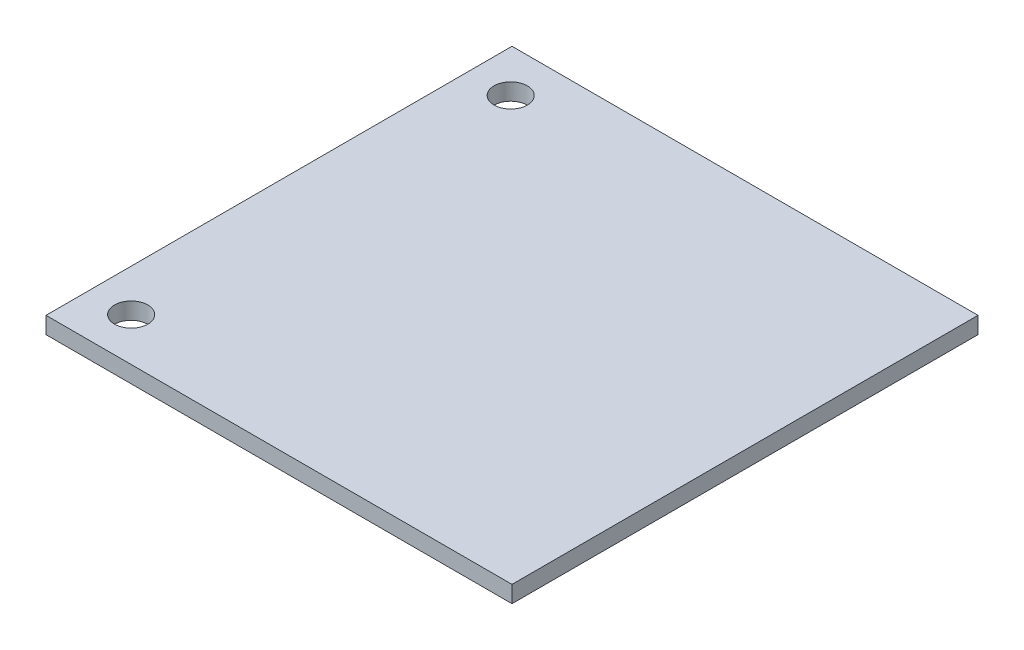
ISO-10303-21;
HEADER;
FILE_DESCRIPTION(('STEP AP214'),'2;1');
FILE_NAME('part.step','',(''),(''),'','','');
FILE_SCHEMA(('AUTOMOTIVE_DESIGN { 1 0 10303 214 1 1 1 1 }'));
ENDSEC;
DATA;
#1=APPLICATION_CONTEXT('core data for automotive mechanical design processes');
#2=APPLICATION_PROTOCOL_DEFINITION('international standard','automotive_design',2000,#1);
#3=PRODUCT_CONTEXT('',#1,'mechanical');
#4=PRODUCT('Part','Part','',(#3));
#5=PRODUCT_RELATED_PRODUCT_CATEGORY('part','',(#4));
#6=PRODUCT_DEFINITION_FORMATION('','',#4);
#7=PRODUCT_DEFINITION_CONTEXT('part definition',#1,'design');
#8=PRODUCT_DEFINITION('design','',#6,#7);
#9=PRODUCT_DEFINITION_SHAPE('','',#8);
#10=(LENGTH_UNIT() NAMED_UNIT(*) SI_UNIT(.MILLI.,.METRE.));
#11=(NAMED_UNIT(*) PLANE_ANGLE_UNIT() SI_UNIT($,.RADIAN.));
#12=(NAMED_UNIT(*) SI_UNIT($,.STERADIAN.) SOLID_ANGLE_UNIT());
#13=UNCERTAINTY_MEASURE_WITH_UNIT(LENGTH_MEASURE(1.E-05),#10,'distance_accuracy_value','');
#14=(GEOMETRIC_REPRESENTATION_CONTEXT(3) GLOBAL_UNCERTAINTY_ASSIGNED_CONTEXT((#13)) GLOBAL_UNIT_ASSIGNED_CONTEXT((#10,
#11,#12)) REPRESENTATION_CONTEXT('',''));
#15=CARTESIAN_POINT('',(0.,0.,0.));
#16=DIRECTION('',(0.,0.,1.));
#17=DIRECTION('',(1.,0.,0.));
#18=AXIS2_PLACEMENT_3D('',#15,#16,#17);
#19=CARTESIAN_POINT('',(0.,1.6,0.));
#20=DIRECTION('',(0.,1.,0.));
#21=DIRECTION('',(0.,0.,1.));
#22=AXIS2_PLACEMENT_3D('',#19,#20,#21);
#23=PLANE('',#22);
#24=CARTESIAN_POINT('',(-18.225,1.6,-18.1));
#25=DIRECTION('',(0.,1.,0.));
#26=DIRECTION('',(0.,0.,1.));
#27=AXIS2_PLACEMENT_3D('',#24,#25,#26);
#28=CIRCLE('',#27,1.59);
#29=CARTESIAN_POINT('',(-18.225,1.6,-16.51));
#30=VERTEX_POINT('',#29);
#31=EDGE_CURVE('E100',#30,#30,#28,.T.);
#32=ORIENTED_EDGE('',*,*,#31,.F.);
#33=EDGE_LOOP('',(#32));
#34=FACE_BOUND('',#33,.T.);
#35=DIRECTION('',(0.,0.,1.));
#36=VECTOR('',#35,1.);
#37=CARTESIAN_POINT('',(-22.225,1.6,-22.225));
#38=LINE('',#37,#36);
#39=CARTESIAN_POINT('',(-22.225,1.6,-22.225));
#40=VERTEX_POINT('',#39);
#41=CARTESIAN_POINT('',(-22.225,1.6,22.225));
#42=VERTEX_POINT('',#41);
#43=EDGE_CURVE('E85',#40,#42,#38,.T.);
#44=ORIENTED_EDGE('',*,*,#43,.T.);
#45=DIRECTION('',(1.,0.,0.));
#46=VECTOR('',#45,1.);
#47=CARTESIAN_POINT('',(-22.225,1.6,22.225));
#48=LINE('',#47,#46);
#49=CARTESIAN_POINT('',(22.225,1.6,22.225));
#50=VERTEX_POINT('',#49);
#51=EDGE_CURVE('E80',#42,#50,#48,.T.);
#52=ORIENTED_EDGE('',*,*,#51,.T.);
#53=DIRECTION('',(0.,0.,-1.));
#54=VECTOR('',#53,1.);
#55=CARTESIAN_POINT('',(22.225,1.6,-22.225));
#56=LINE('',#55,#54);
#57=CARTESIAN_POINT('',(22.225,1.6,-22.225));
#58=VERTEX_POINT('',#57);
#59=EDGE_CURVE('E83',#50,#58,#56,.T.);
#60=ORIENTED_EDGE('',*,*,#59,.T.);
#61=DIRECTION('',(-1.,0.,0.));
#62=VECTOR('',#61,1.);
#63=CARTESIAN_POINT('',(-22.225,1.6,-22.225));
#64=LINE('',#63,#62);
#65=EDGE_CURVE('E50',#58,#40,#64,.T.);
#66=ORIENTED_EDGE('',*,*,#65,.T.);
#67=EDGE_LOOP('',(#44,#52,#60,#66));
#68=FACE_BOUND('',#67,.T.);
#69=CARTESIAN_POINT('',(-18.225,1.6,18.1));
#70=DIRECTION('',(0.,1.,0.));
#71=DIRECTION('',(0.,0.,1.));
#72=AXIS2_PLACEMENT_3D('',#69,#70,#71);
#73=CIRCLE('',#72,1.59);
#74=CARTESIAN_POINT('',(-18.225,1.6,19.69));
#75=VERTEX_POINT('',#74);
#76=EDGE_CURVE('E115',#75,#75,#73,.T.);
#77=ORIENTED_EDGE('',*,*,#76,.F.);
#78=EDGE_LOOP('',(#77));
#79=FACE_BOUND('',#78,.T.);
#80=ADVANCED_FACE('F33',(#34,#68,#79),#23,.T.);
#81=CARTESIAN_POINT('',(0.,0.,0.));
#82=DIRECTION('',(0.,1.,0.));
#83=DIRECTION('',(0.,0.,1.));
#84=AXIS2_PLACEMENT_3D('',#81,#82,#83);
#85=PLANE('',#84);
#86=CARTESIAN_POINT('',(-18.225,0.,-18.1));
#87=DIRECTION('',(0.,1.,0.));
#88=DIRECTION('',(0.,0.,1.));
#89=AXIS2_PLACEMENT_3D('',#86,#87,#88);
#90=CIRCLE('',#89,1.59);
#91=CARTESIAN_POINT('',(-18.225,0.,-16.51));
#92=VERTEX_POINT('',#91);
#93=EDGE_CURVE('E112',#92,#92,#90,.T.);
#94=ORIENTED_EDGE('',*,*,#93,.T.);
#95=EDGE_LOOP('',(#94));
#96=FACE_BOUND('',#95,.T.);
#97=DIRECTION('',(0.,0.,1.));
#98=VECTOR('',#97,1.);
#99=CARTESIAN_POINT('',(-22.225,0.,-22.225));
#100=LINE('',#99,#98);
#101=CARTESIAN_POINT('',(-22.225,0.,-22.225));
#102=VERTEX_POINT('',#101);
#103=CARTESIAN_POINT('',(-22.225,0.,22.225));
#104=VERTEX_POINT('',#103);
#105=EDGE_CURVE('E97',#102,#104,#100,.T.);
#106=ORIENTED_EDGE('',*,*,#105,.F.);
#107=DIRECTION('',(-1.,0.,0.));
#108=VECTOR('',#107,1.);
#109=CARTESIAN_POINT('',(-22.225,0.,-22.225));
#110=LINE('',#109,#108);
#111=CARTESIAN_POINT('',(22.225,0.,-22.225));
#112=VERTEX_POINT('',#111);
#113=EDGE_CURVE('E73',#112,#102,#110,.T.);
#114=ORIENTED_EDGE('',*,*,#113,.F.);
#115=DIRECTION('',(0.,0.,-1.));
#116=VECTOR('',#115,1.);
#117=CARTESIAN_POINT('',(22.225,0.,-22.225));
#118=LINE('',#117,#116);
#119=CARTESIAN_POINT('',(22.225,0.,22.225));
#120=VERTEX_POINT('',#119);
#121=EDGE_CURVE('E67',#120,#112,#118,.T.);
#122=ORIENTED_EDGE('',*,*,#121,.F.);
#123=DIRECTION('',(1.,0.,0.));
#124=VECTOR('',#123,1.);
#125=CARTESIAN_POINT('',(-22.225,0.,22.225));
#126=LINE('',#125,#124);
#127=EDGE_CURVE('E89',#104,#120,#126,.T.);
#128=ORIENTED_EDGE('',*,*,#127,.F.);
#129=EDGE_LOOP('',(#106,#114,#122,#128));
#130=FACE_BOUND('',#129,.T.);
#131=CARTESIAN_POINT('',(-18.225,0.,18.1));
#132=DIRECTION('',(0.,1.,0.));
#133=DIRECTION('',(0.,0.,1.));
#134=AXIS2_PLACEMENT_3D('',#131,#132,#133);
#135=CIRCLE('',#134,1.59);
#136=CARTESIAN_POINT('',(-18.225,0.,19.69));
#137=VERTEX_POINT('',#136);
#138=EDGE_CURVE('E118',#137,#137,#135,.T.);
#139=ORIENTED_EDGE('',*,*,#138,.T.);
#140=EDGE_LOOP('',(#139));
#141=FACE_BOUND('',#140,.T.);
#142=ADVANCED_FACE('F108',(#96,#130,#141),#85,.F.);
#143=CARTESIAN_POINT('',(-22.225,1.6,-22.225));
#144=DIRECTION('',(1.,0.,0.));
#145=DIRECTION('',(0.,0.,-1.));
#146=AXIS2_PLACEMENT_3D('',#143,#144,#145);
#147=PLANE('',#146);
#148=ORIENTED_EDGE('',*,*,#105,.T.);
#149=DIRECTION('',(0.,-1.,0.));
#150=VECTOR('',#149,1.);
#151=CARTESIAN_POINT('',(-22.225,1.6,22.225));
#152=LINE('',#151,#150);
#153=EDGE_CURVE('E11',#42,#104,#152,.T.);
#154=ORIENTED_EDGE('',*,*,#153,.F.);
#155=ORIENTED_EDGE('',*,*,#43,.F.);
#156=DIRECTION('',(0.,-1.,0.));
#157=VECTOR('',#156,1.);
#158=CARTESIAN_POINT('',(-22.225,1.6,-22.225));
#159=LINE('',#158,#157);
#160=EDGE_CURVE('E93',#40,#102,#159,.T.);
#161=ORIENTED_EDGE('',*,*,#160,.T.);
#162=EDGE_LOOP('',(#148,#154,#155,#161));
#163=FACE_BOUND('',#162,.T.);
#164=ADVANCED_FACE('F35',(#163),#147,.F.);
#165=CARTESIAN_POINT('',(-22.225,1.6,22.225));
#166=DIRECTION('',(0.,0.,-1.));
#167=DIRECTION('',(-1.,0.,0.));
#168=AXIS2_PLACEMENT_3D('',#165,#166,#167);
#169=PLANE('',#168);
#170=ORIENTED_EDGE('',*,*,#127,.T.);
#171=DIRECTION('',(0.,-1.,0.));
#172=VECTOR('',#171,1.);
#173=CARTESIAN_POINT('',(22.225,1.6,22.225));
#174=LINE('',#173,#172);
#175=EDGE_CURVE('E42',#50,#120,#174,.T.);
#176=ORIENTED_EDGE('',*,*,#175,.F.);
#177=ORIENTED_EDGE('',*,*,#51,.F.);
#178=ORIENTED_EDGE('',*,*,#153,.T.);
#179=EDGE_LOOP('',(#170,#176,#177,#178));
#180=FACE_BOUND('',#179,.T.);
#181=ADVANCED_FACE('F88',(#180),#169,.F.);
#182=CARTESIAN_POINT('',(22.225,1.6,-22.225));
#183=DIRECTION('',(-1.,0.,0.));
#184=DIRECTION('',(0.,0.,1.));
#185=AXIS2_PLACEMENT_3D('',#182,#183,#184);
#186=PLANE('',#185);
#187=ORIENTED_EDGE('',*,*,#121,.T.);
#188=DIRECTION('',(0.,-1.,0.));
#189=VECTOR('',#188,1.);
#190=CARTESIAN_POINT('',(22.225,1.6,-22.225));
#191=LINE('',#190,#189);
#192=EDGE_CURVE('E90',#58,#112,#191,.T.);
#193=ORIENTED_EDGE('',*,*,#192,.F.);
#194=ORIENTED_EDGE('',*,*,#59,.F.);
#195=ORIENTED_EDGE('',*,*,#175,.T.);
#196=EDGE_LOOP('',(#187,#193,#194,#195));
#197=FACE_BOUND('',#196,.T.);
#198=ADVANCED_FACE('F91',(#197),#186,.F.);
#199=CARTESIAN_POINT('',(-22.225,1.6,-22.225));
#200=DIRECTION('',(0.,0.,1.));
#201=DIRECTION('',(1.,0.,0.));
#202=AXIS2_PLACEMENT_3D('',#199,#200,#201);
#203=PLANE('',#202);
#204=ORIENTED_EDGE('',*,*,#113,.T.);
#205=ORIENTED_EDGE('',*,*,#160,.F.);
#206=ORIENTED_EDGE('',*,*,#65,.F.);
#207=ORIENTED_EDGE('',*,*,#192,.T.);
#208=EDGE_LOOP('',(#204,#205,#206,#207));
#209=FACE_BOUND('',#208,.T.);
#210=ADVANCED_FACE('F105',(#209),#203,.F.);
#211=CARTESIAN_POINT('',(-18.225,1.6,-18.1));
#212=DIRECTION('',(0.,-1.,0.));
#213=DIRECTION('',(0.,0.,-1.));
#214=AXIS2_PLACEMENT_3D('',#211,#212,#213);
#215=CYLINDRICAL_SURFACE('',#214,1.59);
#216=ORIENTED_EDGE('',*,*,#31,.T.);
#217=EDGE_LOOP('',(#216));
#218=FACE_BOUND('',#217,.T.);
#219=ORIENTED_EDGE('',*,*,#93,.F.);
#220=EDGE_LOOP('',(#219));
#221=FACE_BOUND('',#220,.T.);
#222=ADVANCED_FACE('F136',(#218,#221),#215,.F.);
#223=CARTESIAN_POINT('',(-18.225,1.6,18.1));
#224=DIRECTION('',(0.,-1.,0.));
#225=DIRECTION('',(0.,0.,-1.));
#226=AXIS2_PLACEMENT_3D('',#223,#224,#225);
#227=CYLINDRICAL_SURFACE('',#226,1.59);
#228=ORIENTED_EDGE('',*,*,#76,.T.);
#229=EDGE_LOOP('',(#228));
#230=FACE_BOUND('',#229,.T.);
#231=ORIENTED_EDGE('',*,*,#138,.F.);
#232=EDGE_LOOP('',(#231));
#233=FACE_BOUND('',#232,.T.);
#234=ADVANCED_FACE('F124',(#230,#233),#227,.F.);
#235=CLOSED_SHELL('',(#80,#142,#164,#181,#198,#210,#222,#234));
#236=MANIFOLD_SOLID_BREP('B2',#235);
#237=ADVANCED_BREP_SHAPE_REPRESENTATION('',(#18,#236),#14);
#238=SHAPE_DEFINITION_REPRESENTATION(#9,#237);
ENDSEC;
END-ISO-10303-21;
